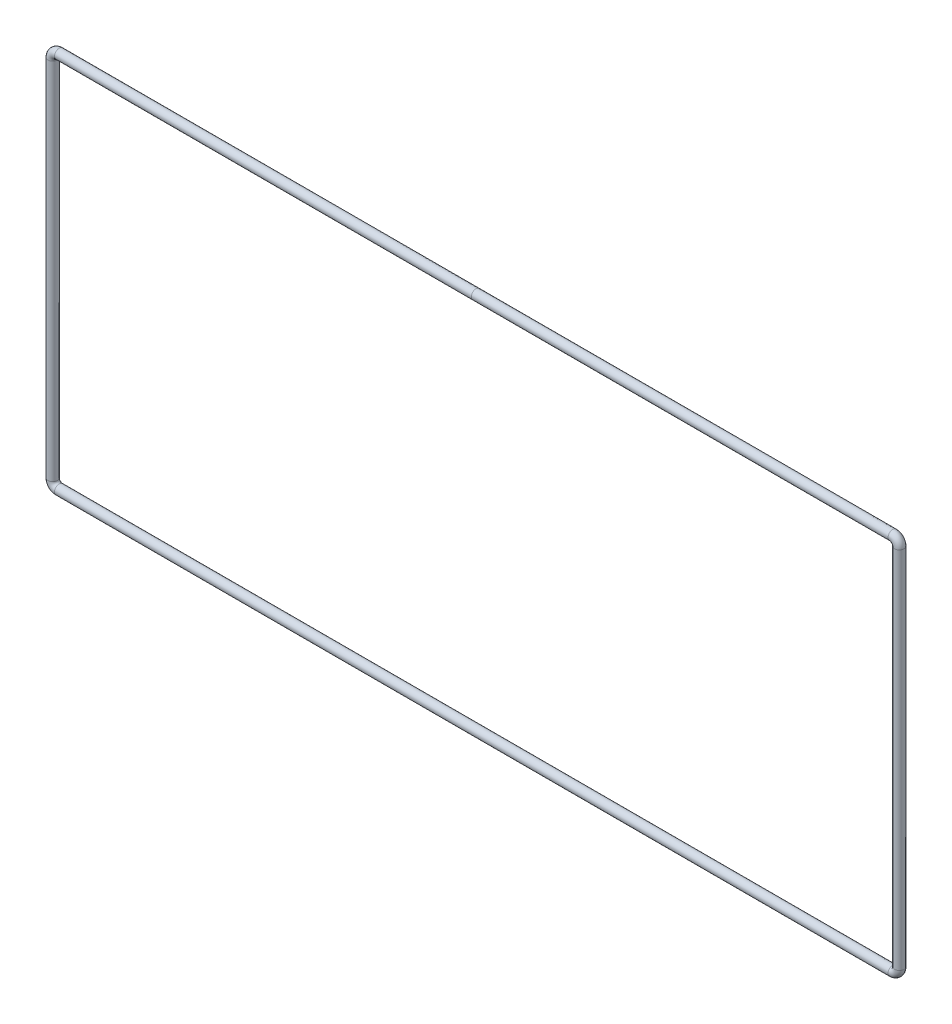
ISO-10303-21;
HEADER;
FILE_DESCRIPTION(('STEP AP214'),'2;1');
FILE_NAME('part.step','',(''),(''),'','','');
FILE_SCHEMA(('AUTOMOTIVE_DESIGN { 1 0 10303 214 1 1 1 1 }'));
ENDSEC;
DATA;
#1=APPLICATION_CONTEXT('core data for automotive mechanical design processes');
#2=APPLICATION_PROTOCOL_DEFINITION('international standard','automotive_design',2000,#1);
#3=PRODUCT_CONTEXT('',#1,'mechanical');
#4=PRODUCT('Part','Part','',(#3));
#5=PRODUCT_RELATED_PRODUCT_CATEGORY('part','',(#4));
#6=PRODUCT_DEFINITION_FORMATION('','',#4);
#7=PRODUCT_DEFINITION_CONTEXT('part definition',#1,'design');
#8=PRODUCT_DEFINITION('design','',#6,#7);
#9=PRODUCT_DEFINITION_SHAPE('','',#8);
#10=(LENGTH_UNIT() NAMED_UNIT(*) SI_UNIT(.MILLI.,.METRE.));
#11=(NAMED_UNIT(*) PLANE_ANGLE_UNIT() SI_UNIT($,.RADIAN.));
#12=(NAMED_UNIT(*) SI_UNIT($,.STERADIAN.) SOLID_ANGLE_UNIT());
#13=UNCERTAINTY_MEASURE_WITH_UNIT(LENGTH_MEASURE(1.E-05),#10,'distance_accuracy_value','');
#14=(GEOMETRIC_REPRESENTATION_CONTEXT(3) GLOBAL_UNCERTAINTY_ASSIGNED_CONTEXT((#13)) GLOBAL_UNIT_ASSIGNED_CONTEXT((#10,
#11,#12)) REPRESENTATION_CONTEXT('',''));
#15=CARTESIAN_POINT('',(0.,0.,0.));
#16=DIRECTION('',(0.,0.,1.));
#17=DIRECTION('',(1.,0.,0.));
#18=AXIS2_PLACEMENT_3D('',#15,#16,#17);
#19=CARTESIAN_POINT('',(-111.,50.5540174570411,0.));
#20=DIRECTION('',(1.,0.,0.));
#21=DIRECTION('',(0.,1.,0.));
#22=AXIS2_PLACEMENT_3D('',#19,#20,#21);
#23=CYLINDRICAL_SURFACE('',#22,1.25);
#24=CARTESIAN_POINT('',(0.,50.5540174570415,0.));
#25=DIRECTION('',(1.,0.,0.));
#26=DIRECTION('',(0.,0.,-1.));
#27=AXIS2_PLACEMENT_3D('',#24,#25,#26);
#28=CIRCLE('',#27,1.25);
#29=CARTESIAN_POINT('',(0.,51.8040174570415,0.));
#30=VERTEX_POINT('',#29);
#31=EDGE_CURVE('E76',#30,#30,#28,.T.);
#32=ORIENTED_EDGE('',*,*,#31,.F.);
#33=EDGE_LOOP('',(#32));
#34=FACE_BOUND('',#33,.T.);
#35=CARTESIAN_POINT('',(-111.000000000002,50.5540174570411,0.));
#36=DIRECTION('',(1.,0.,0.));
#37=DIRECTION('',(0.,0.,-1.));
#38=AXIS2_PLACEMENT_3D('',#35,#36,#37);
#39=CIRCLE('',#38,1.25);
#40=CARTESIAN_POINT('',(-111.000000000003,51.8040174570411,0.));
#41=VERTEX_POINT('',#40);
#42=EDGE_CURVE('E10',#41,#41,#39,.T.);
#43=ORIENTED_EDGE('',*,*,#42,.T.);
#44=EDGE_LOOP('',(#43));
#45=FACE_BOUND('',#44,.T.);
#46=ADVANCED_FACE('F37',(#34,#45),#23,.T.);
#47=CARTESIAN_POINT('',(-111.,48.8040174570406,0.));
#48=DIRECTION('',(0.,0.,-1.));
#49=DIRECTION('',(-1.,0.,0.));
#50=AXIS2_PLACEMENT_3D('',#47,#48,#49);
#51=TOROIDAL_SURFACE('',#50,1.75000000000043,1.25);
#52=CARTESIAN_POINT('',(-112.750000000001,48.8040174570406,0.));
#53=DIRECTION('',(0.,1.,0.));
#54=DIRECTION('',(0.,0.,-1.));
#55=AXIS2_PLACEMENT_3D('',#52,#53,#54);
#56=CIRCLE('',#55,1.25);
#57=CARTESIAN_POINT('',(-114.000000000001,48.8040174570406,0.));
#58=VERTEX_POINT('',#57);
#59=EDGE_CURVE('E44',#58,#58,#56,.T.);
#60=CARTESIAN_POINT('',(-111.,48.8040174570406,0.));
#61=DIRECTION('',(0.,0.,-1.));
#62=DIRECTION('',(-1.,0.,0.));
#63=AXIS2_PLACEMENT_3D('',#60,#61,#62);
#64=CIRCLE('',#63,3.00000000000043);
#65=EDGE_CURVE('',#58,#41,#64,.T.);
#66=ORIENTED_EDGE('',*,*,#59,.T.);
#67=ORIENTED_EDGE('',*,*,#42,.F.);
#68=ORIENTED_EDGE('',*,*,#65,.T.);
#69=ORIENTED_EDGE('',*,*,#65,.F.);
#70=EDGE_LOOP('',(#66,#68,#67,#69));
#71=FACE_BOUND('',#70,.T.);
#72=ADVANCED_FACE('F84',(#71),#51,.T.);
#73=CARTESIAN_POINT('',(-112.75,-48.1959825429592,0.));
#74=DIRECTION('',(0.,1.,0.));
#75=DIRECTION('',(-1.,0.,0.));
#76=AXIS2_PLACEMENT_3D('',#73,#74,#75);
#77=CYLINDRICAL_SURFACE('',#76,1.25);
#78=ORIENTED_EDGE('',*,*,#59,.F.);
#79=EDGE_LOOP('',(#78));
#80=FACE_BOUND('',#79,.T.);
#81=CARTESIAN_POINT('',(-112.75,-48.1959825429592,0.));
#82=DIRECTION('',(0.,1.,0.));
#83=DIRECTION('',(0.,0.,-1.));
#84=AXIS2_PLACEMENT_3D('',#81,#82,#83);
#85=CIRCLE('',#84,1.25);
#86=CARTESIAN_POINT('',(-114.,-48.1959825429592,0.));
#87=VERTEX_POINT('',#86);
#88=EDGE_CURVE('E49',#87,#87,#85,.T.);
#89=ORIENTED_EDGE('',*,*,#88,.T.);
#90=EDGE_LOOP('',(#89));
#91=FACE_BOUND('',#90,.T.);
#92=ADVANCED_FACE('F88',(#80,#91),#77,.T.);
#93=CARTESIAN_POINT('',(-111.,-48.1959825429592,0.));
#94=DIRECTION('',(0.,0.,-1.));
#95=DIRECTION('',(-1.,0.,0.));
#96=AXIS2_PLACEMENT_3D('',#93,#94,#95);
#97=TOROIDAL_SURFACE('',#96,1.75000000000047,1.25);
#98=CARTESIAN_POINT('',(-111.,-49.9459825429596,0.));
#99=DIRECTION('',(-1.,0.,0.));
#100=DIRECTION('',(0.,0.,-1.));
#101=AXIS2_PLACEMENT_3D('',#98,#99,#100);
#102=CIRCLE('',#101,1.25);
#103=CARTESIAN_POINT('',(-111.,-51.1959825429596,0.));
#104=VERTEX_POINT('',#103);
#105=EDGE_CURVE('E54',#104,#104,#102,.T.);
#106=CARTESIAN_POINT('',(-111.,-48.1959825429592,0.));
#107=DIRECTION('',(0.,0.,-1.));
#108=DIRECTION('',(-1.,0.,0.));
#109=AXIS2_PLACEMENT_3D('',#106,#107,#108);
#110=CIRCLE('',#109,3.00000000000047);
#111=EDGE_CURVE('',#104,#87,#110,.T.);
#112=ORIENTED_EDGE('',*,*,#105,.T.);
#113=ORIENTED_EDGE('',*,*,#88,.F.);
#114=ORIENTED_EDGE('',*,*,#111,.T.);
#115=ORIENTED_EDGE('',*,*,#111,.F.);
#116=EDGE_LOOP('',(#112,#114,#113,#115));
#117=FACE_BOUND('',#116,.T.);
#118=ADVANCED_FACE('F93',(#117),#97,.T.);
#119=CARTESIAN_POINT('',(111.000000000006,-49.9459825429596,0.));
#120=DIRECTION('',(-1.,0.,0.));
#121=DIRECTION('',(0.,0.,1.));
#122=AXIS2_PLACEMENT_3D('',#119,#120,#121);
#123=CYLINDRICAL_SURFACE('',#122,1.25);
#124=ORIENTED_EDGE('',*,*,#105,.F.);
#125=EDGE_LOOP('',(#124));
#126=FACE_BOUND('',#125,.T.);
#127=CARTESIAN_POINT('',(111.000000000006,-49.9459825429596,0.));
#128=DIRECTION('',(-1.,-3.72323900582123E-12,0.));
#129=DIRECTION('',(0.,0.,-1.));
#130=AXIS2_PLACEMENT_3D('',#127,#128,#129);
#131=CIRCLE('',#130,1.25);
#132=CARTESIAN_POINT('',(111.000000000011,-51.1959825429596,0.));
#133=VERTEX_POINT('',#132);
#134=EDGE_CURVE('E60',#133,#133,#131,.T.);
#135=ORIENTED_EDGE('',*,*,#134,.T.);
#136=EDGE_LOOP('',(#135));
#137=FACE_BOUND('',#136,.T.);
#138=ADVANCED_FACE('F99',(#126,#137),#123,.T.);
#139=CARTESIAN_POINT('',(111.,-48.1959825429592,0.));
#140=DIRECTION('',(0.,0.,-1.));
#141=DIRECTION('',(-1.,0.,0.));
#142=AXIS2_PLACEMENT_3D('',#139,#140,#141);
#143=TOROIDAL_SURFACE('',#142,1.75000000000045,1.25);
#144=CARTESIAN_POINT('',(112.75,-48.1959825429585,0.));
#145=DIRECTION('',(0.,-1.,0.));
#146=DIRECTION('',(0.,0.,-1.));
#147=AXIS2_PLACEMENT_3D('',#144,#145,#146);
#148=CIRCLE('',#147,1.25);
#149=CARTESIAN_POINT('',(114.,-48.1959825429581,0.));
#150=VERTEX_POINT('',#149);
#151=EDGE_CURVE('E64',#150,#150,#148,.T.);
#152=CARTESIAN_POINT('',(111.,-48.1959825429592,0.));
#153=DIRECTION('',(0.,0.,-1.));
#154=DIRECTION('',(-1.,0.,0.));
#155=AXIS2_PLACEMENT_3D('',#152,#153,#154);
#156=CIRCLE('',#155,3.00000000000045);
#157=EDGE_CURVE('',#150,#133,#156,.T.);
#158=ORIENTED_EDGE('',*,*,#151,.T.);
#159=ORIENTED_EDGE('',*,*,#134,.F.);
#160=ORIENTED_EDGE('',*,*,#157,.T.);
#161=ORIENTED_EDGE('',*,*,#157,.F.);
#162=EDGE_LOOP('',(#158,#160,#159,#161));
#163=FACE_BOUND('',#162,.T.);
#164=ADVANCED_FACE('F103',(#163),#143,.T.);
#165=CARTESIAN_POINT('',(112.75,48.8040174570415,0.));
#166=DIRECTION('',(0.,-1.,0.));
#167=DIRECTION('',(0.,0.,-1.));
#168=AXIS2_PLACEMENT_3D('',#165,#166,#167);
#169=CYLINDRICAL_SURFACE('',#168,1.25);
#170=ORIENTED_EDGE('',*,*,#151,.F.);
#171=EDGE_LOOP('',(#170));
#172=FACE_BOUND('',#171,.T.);
#173=CARTESIAN_POINT('',(112.75,48.8040174570415,0.));
#174=DIRECTION('',(0.,-1.,0.));
#175=DIRECTION('',(0.,0.,-1.));
#176=AXIS2_PLACEMENT_3D('',#173,#174,#175);
#177=CIRCLE('',#176,1.25);
#178=CARTESIAN_POINT('',(114.,48.8040174570415,0.));
#179=VERTEX_POINT('',#178);
#180=EDGE_CURVE('E68',#179,#179,#177,.T.);
#181=ORIENTED_EDGE('',*,*,#180,.T.);
#182=EDGE_LOOP('',(#181));
#183=FACE_BOUND('',#182,.T.);
#184=ADVANCED_FACE('F107',(#172,#183),#169,.T.);
#185=CARTESIAN_POINT('',(111.,48.8040174570415,0.));
#186=DIRECTION('',(0.,0.,-1.));
#187=DIRECTION('',(-1.,0.,0.));
#188=AXIS2_PLACEMENT_3D('',#185,#186,#187);
#189=TOROIDAL_SURFACE('',#188,1.75000000000042,1.25);
#190=CARTESIAN_POINT('',(111.,50.5540174570419,0.));
#191=DIRECTION('',(1.,0.,0.));
#192=DIRECTION('',(0.,0.,-1.));
#193=AXIS2_PLACEMENT_3D('',#190,#191,#192);
#194=CIRCLE('',#193,1.25);
#195=CARTESIAN_POINT('',(111.,51.8040174570419,0.));
#196=VERTEX_POINT('',#195);
#197=EDGE_CURVE('E72',#196,#196,#194,.T.);
#198=CARTESIAN_POINT('',(111.,48.8040174570415,0.));
#199=DIRECTION('',(0.,0.,-1.));
#200=DIRECTION('',(-1.,0.,0.));
#201=AXIS2_PLACEMENT_3D('',#198,#199,#200);
#202=CIRCLE('',#201,3.00000000000042);
#203=EDGE_CURVE('',#196,#179,#202,.T.);
#204=ORIENTED_EDGE('',*,*,#197,.T.);
#205=ORIENTED_EDGE('',*,*,#180,.F.);
#206=ORIENTED_EDGE('',*,*,#203,.T.);
#207=ORIENTED_EDGE('',*,*,#203,.F.);
#208=EDGE_LOOP('',(#204,#206,#205,#207));
#209=FACE_BOUND('',#208,.T.);
#210=ADVANCED_FACE('F111',(#209),#189,.T.);
#211=CARTESIAN_POINT('',(0.,50.5540174570415,0.));
#212=DIRECTION('',(1.,0.,0.));
#213=DIRECTION('',(0.,1.,0.));
#214=AXIS2_PLACEMENT_3D('',#211,#212,#213);
#215=CYLINDRICAL_SURFACE('',#214,1.25);
#216=CARTESIAN_POINT('',(111.,51.8040174570419,0.));
#217=CARTESIAN_POINT('',(109.84375,51.8040174570419,0.));
#218=CARTESIAN_POINT('',(108.6875,51.8040174570419,0.));
#219=CARTESIAN_POINT('',(106.375,51.8040174570419,0.));
#220=CARTESIAN_POINT('',(105.21875,51.8040174570419,0.));
#221=CARTESIAN_POINT('',(102.90625,51.8040174570419,0.));
#222=CARTESIAN_POINT('',(101.75,51.8040174570419,0.));
#223=CARTESIAN_POINT('',(99.4375,51.8040174570419,0.));
#224=CARTESIAN_POINT('',(98.28125,51.8040174570419,0.));
#225=CARTESIAN_POINT('',(95.96875,51.8040174570419,0.));
#226=CARTESIAN_POINT('',(94.8125,51.8040174570419,0.));
#227=CARTESIAN_POINT('',(92.5,51.8040174570419,0.));
#228=CARTESIAN_POINT('',(91.34375,51.8040174570419,0.));
#229=CARTESIAN_POINT('',(89.03125,51.8040174570418,0.));
#230=CARTESIAN_POINT('',(87.875,51.8040174570418,0.));
#231=CARTESIAN_POINT('',(85.5625,51.8040174570418,0.));
#232=CARTESIAN_POINT('',(84.40625,51.8040174570418,0.));
#233=CARTESIAN_POINT('',(82.09375,51.8040174570418,0.));
#234=CARTESIAN_POINT('',(80.9375,51.8040174570418,0.));
#235=CARTESIAN_POINT('',(78.625,51.8040174570418,0.));
#236=CARTESIAN_POINT('',(77.46875,51.8040174570418,0.));
#237=CARTESIAN_POINT('',(75.15625,51.8040174570418,0.));
#238=CARTESIAN_POINT('',(74.,51.8040174570418,0.));
#239=CARTESIAN_POINT('',(71.6875,51.8040174570418,0.));
#240=CARTESIAN_POINT('',(70.53125,51.8040174570418,0.));
#241=CARTESIAN_POINT('',(68.21875,51.8040174570418,0.));
#242=CARTESIAN_POINT('',(67.0625,51.8040174570418,0.));
#243=CARTESIAN_POINT('',(64.75,51.8040174570417,0.));
#244=CARTESIAN_POINT('',(63.59375,51.8040174570417,0.));
#245=CARTESIAN_POINT('',(61.28125,51.8040174570417,0.));
#246=CARTESIAN_POINT('',(60.125,51.8040174570417,0.));
#247=CARTESIAN_POINT('',(57.8125,51.8040174570417,0.));
#248=CARTESIAN_POINT('',(56.65625,51.8040174570417,0.));
#249=CARTESIAN_POINT('',(54.34375,51.8040174570417,0.));
#250=CARTESIAN_POINT('',(53.1875,51.8040174570417,0.));
#251=CARTESIAN_POINT('',(50.875,51.8040174570417,0.));
#252=CARTESIAN_POINT('',(49.71875,51.8040174570417,0.));
#253=CARTESIAN_POINT('',(47.40625,51.8040174570417,0.));
#254=CARTESIAN_POINT('',(46.25,51.8040174570417,0.));
#255=CARTESIAN_POINT('',(43.9375,51.8040174570417,0.));
#256=CARTESIAN_POINT('',(42.78125,51.8040174570417,0.));
#257=CARTESIAN_POINT('',(40.46875,51.8040174570417,0.));
#258=CARTESIAN_POINT('',(39.3125,51.8040174570417,0.));
#259=CARTESIAN_POINT('',(37.,51.8040174570416,0.));
#260=CARTESIAN_POINT('',(35.84375,51.8040174570416,0.));
#261=CARTESIAN_POINT('',(33.53125,51.8040174570416,0.));
#262=CARTESIAN_POINT('',(32.375,51.8040174570416,0.));
#263=CARTESIAN_POINT('',(30.0625,51.8040174570416,0.));
#264=CARTESIAN_POINT('',(28.90625,51.8040174570416,0.));
#265=CARTESIAN_POINT('',(26.59375,51.8040174570416,0.));
#266=CARTESIAN_POINT('',(25.4375,51.8040174570416,0.));
#267=CARTESIAN_POINT('',(23.125,51.8040174570416,0.));
#268=CARTESIAN_POINT('',(21.96875,51.8040174570416,0.));
#269=CARTESIAN_POINT('',(19.65625,51.8040174570416,0.));
#270=CARTESIAN_POINT('',(18.5,51.8040174570416,0.));
#271=CARTESIAN_POINT('',(16.1875,51.8040174570416,0.));
#272=CARTESIAN_POINT('',(15.03125,51.8040174570416,0.));
#273=CARTESIAN_POINT('',(12.71875,51.8040174570415,0.));
#274=CARTESIAN_POINT('',(11.5625,51.8040174570415,0.));
#275=CARTESIAN_POINT('',(9.24999999999999,51.8040174570415,0.));
#276=CARTESIAN_POINT('',(8.09374999999999,51.8040174570415,0.));
#277=CARTESIAN_POINT('',(5.78124999999999,51.8040174570415,0.));
#278=CARTESIAN_POINT('',(4.62499999999999,51.8040174570415,0.));
#279=CARTESIAN_POINT('',(2.31249999999999,51.8040174570415,0.));
#280=CARTESIAN_POINT('',(1.15624999999999,51.8040174570415,0.));
#281=CARTESIAN_POINT('',(0.,51.8040174570415,0.));
#282=B_SPLINE_CURVE_WITH_KNOTS('',3,(#216,#217,#218,#219,#220,#221,#222,#223,#224,#225,#226,
#227,#228,#229,#230,#231,#232,#233,#234,#235,#236,#237,#238,#239,#240,#241,#242,#243,#244,#245,
#246,#247,#248,#249,#250,#251,#252,#253,#254,#255,#256,#257,#258,#259,#260,#261,#262,#263,#264,
#265,#266,#267,#268,#269,#270,#271,#272,#273,#274,#275,#276,#277,#278,#279,#280,#281),
.UNSPECIFIED.,.F.,.F.,(4,2,2,2,2,2,2,2,2,2,2,2,2,2,2,2,2,2,2,2,2,2,2,2,2,2,2,2,2,2,2,2,4),(0.,
3.46875000000001,6.9375,10.40625,13.875,17.34375,20.8125,24.28125,27.75,31.21875,34.6875,
38.15625,41.625,45.09375,48.5625,52.03125,55.5,58.96875,62.4375,65.90625,69.375,72.84375,
76.3125,79.78125,83.25,86.71875,90.1875,93.65625,97.125,100.59375,104.0625,107.53125,111.),.UNSPECIFIED.);
#283=EDGE_CURVE('BSEAM81',#196,#30,#282,.T.);
#284=ORIENTED_EDGE('',*,*,#197,.F.);
#285=ORIENTED_EDGE('',*,*,#31,.T.);
#286=ORIENTED_EDGE('',*,*,#283,.T.);
#287=ORIENTED_EDGE('',*,*,#283,.F.);
#288=EDGE_LOOP('',(#284,#286,#285,#287));
#289=FACE_BOUND('',#288,.T.);
#290=ADVANCED_FACE('F81',(#289),#215,.T.);
#291=CLOSED_SHELL('',(#46,#72,#92,#118,#138,#164,#184,#210,#290));
#292=MANIFOLD_SOLID_BREP('B2',#291);
#293=ADVANCED_BREP_SHAPE_REPRESENTATION('',(#18,#292),#14);
#294=SHAPE_DEFINITION_REPRESENTATION(#9,#293);
ENDSEC;
END-ISO-10303-21;
